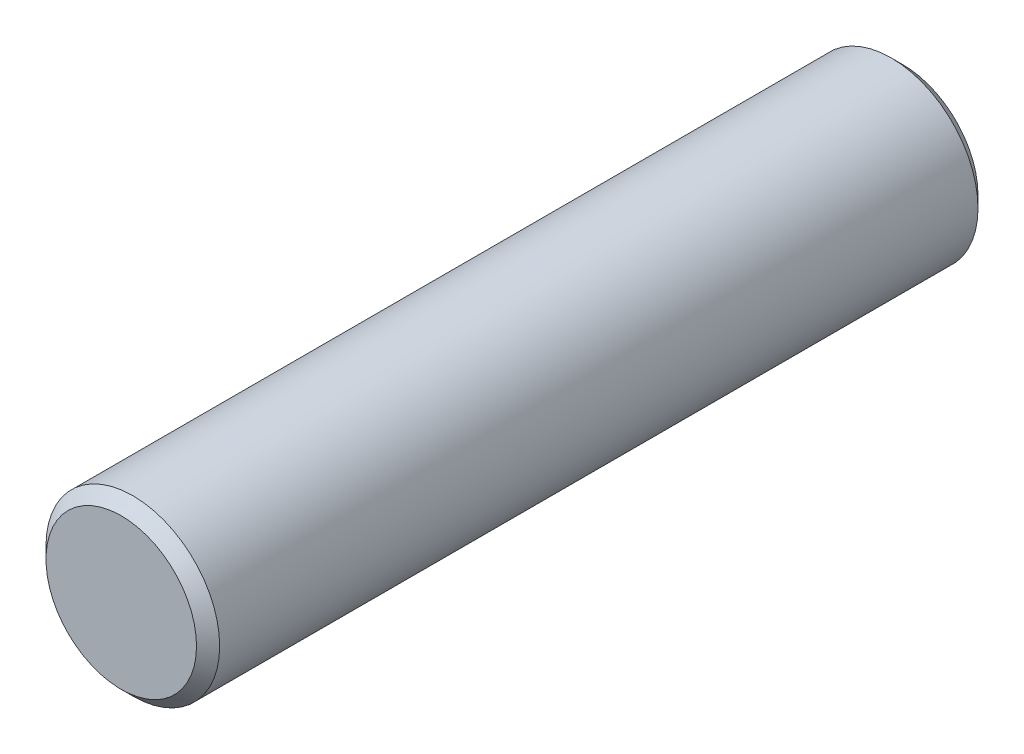
ISO-10303-21;
HEADER;
FILE_DESCRIPTION(('STEP AP214'),'2;1');
FILE_NAME('part.step','',(''),(''),'','','');
FILE_SCHEMA(('AUTOMOTIVE_DESIGN { 1 0 10303 214 1 1 1 1 }'));
ENDSEC;
DATA;
#1=APPLICATION_CONTEXT('core data for automotive mechanical design processes');
#2=APPLICATION_PROTOCOL_DEFINITION('international standard','automotive_design',2000,#1);
#3=PRODUCT_CONTEXT('',#1,'mechanical');
#4=PRODUCT('Part','Part','',(#3));
#5=PRODUCT_RELATED_PRODUCT_CATEGORY('part','',(#4));
#6=PRODUCT_DEFINITION_FORMATION('','',#4);
#7=PRODUCT_DEFINITION_CONTEXT('part definition',#1,'design');
#8=PRODUCT_DEFINITION('design','',#6,#7);
#9=PRODUCT_DEFINITION_SHAPE('','',#8);
#10=(LENGTH_UNIT() NAMED_UNIT(*) SI_UNIT(.MILLI.,.METRE.));
#11=(NAMED_UNIT(*) PLANE_ANGLE_UNIT() SI_UNIT($,.RADIAN.));
#12=(NAMED_UNIT(*) SI_UNIT($,.STERADIAN.) SOLID_ANGLE_UNIT());
#13=UNCERTAINTY_MEASURE_WITH_UNIT(LENGTH_MEASURE(1.E-05),#10,'distance_accuracy_value','');
#14=(GEOMETRIC_REPRESENTATION_CONTEXT(3) GLOBAL_UNCERTAINTY_ASSIGNED_CONTEXT((#13)) GLOBAL_UNIT_ASSIGNED_CONTEXT((#10,
#11,#12)) REPRESENTATION_CONTEXT('',''));
#15=CARTESIAN_POINT('',(0.,0.,0.));
#16=DIRECTION('',(0.,0.,1.));
#17=DIRECTION('',(1.,0.,0.));
#18=AXIS2_PLACEMENT_3D('',#15,#16,#17);
#19=CARTESIAN_POINT('',(0.,0.,6.75));
#20=DIRECTION('',(0.,0.,-1.));
#21=DIRECTION('',(-1.,0.,0.));
#22=AXIS2_PLACEMENT_3D('',#19,#20,#21);
#23=CYLINDRICAL_SURFACE('',#22,1.5);
#24=CARTESIAN_POINT('',(0.,0.,-6.55));
#25=DIRECTION('',(0.,0.,1.));
#26=DIRECTION('',(1.,0.,0.));
#27=AXIS2_PLACEMENT_3D('',#24,#25,#26);
#28=CIRCLE('',#27,1.5);
#29=CARTESIAN_POINT('',(1.5,0.,-6.55));
#30=VERTEX_POINT('',#29);
#31=EDGE_CURVE('E44',#30,#30,#28,.T.);
#32=ORIENTED_EDGE('',*,*,#31,.T.);
#33=EDGE_LOOP('',(#32));
#34=FACE_BOUND('',#33,.T.);
#35=CARTESIAN_POINT('',(0.,0.,6.55));
#36=DIRECTION('',(0.,0.,1.));
#37=DIRECTION('',(1.,0.,0.));
#38=AXIS2_PLACEMENT_3D('',#35,#36,#37);
#39=CIRCLE('',#38,1.5);
#40=CARTESIAN_POINT('',(1.5,0.,6.55));
#41=VERTEX_POINT('',#40);
#42=EDGE_CURVE('E48',#41,#41,#39,.F.);
#43=ORIENTED_EDGE('',*,*,#42,.T.);
#44=EDGE_LOOP('',(#43));
#45=FACE_BOUND('',#44,.T.);
#46=ADVANCED_FACE('F33',(#34,#45),#23,.T.);
#47=CARTESIAN_POINT('',(0.,0.,6.75));
#48=DIRECTION('',(0.,0.,1.));
#49=DIRECTION('',(1.,0.,0.));
#50=AXIS2_PLACEMENT_3D('',#47,#48,#49);
#51=PLANE('',#50);
#52=CARTESIAN_POINT('',(0.,0.,6.75));
#53=DIRECTION('',(0.,0.,1.));
#54=DIRECTION('',(1.,0.,0.));
#55=AXIS2_PLACEMENT_3D('',#52,#53,#54);
#56=CIRCLE('',#55,1.30000000000001);
#57=CARTESIAN_POINT('',(1.30000000000001,0.,6.75));
#58=VERTEX_POINT('',#57);
#59=EDGE_CURVE('E10',#58,#58,#56,.T.);
#60=ORIENTED_EDGE('',*,*,#59,.T.);
#61=EDGE_LOOP('',(#60));
#62=FACE_BOUND('',#61,.T.);
#63=ADVANCED_FACE('F64',(#62),#51,.T.);
#64=CARTESIAN_POINT('',(0.,0.,-6.75));
#65=DIRECTION('',(0.,0.,1.));
#66=DIRECTION('',(1.,0.,0.));
#67=AXIS2_PLACEMENT_3D('',#64,#65,#66);
#68=PLANE('',#67);
#69=CARTESIAN_POINT('',(0.,0.,-6.75));
#70=DIRECTION('',(0.,0.,1.));
#71=DIRECTION('',(1.,0.,0.));
#72=AXIS2_PLACEMENT_3D('',#69,#70,#71);
#73=CIRCLE('',#72,1.3);
#74=CARTESIAN_POINT('',(1.3,0.,-6.75));
#75=VERTEX_POINT('',#74);
#76=EDGE_CURVE('E40',#75,#75,#73,.F.);
#77=ORIENTED_EDGE('',*,*,#76,.T.);
#78=EDGE_LOOP('',(#77));
#79=FACE_BOUND('',#78,.T.);
#80=ADVANCED_FACE('F61',(#79),#68,.F.);
#81=CARTESIAN_POINT('',(0.,0.,-6.55));
#82=DIRECTION('',(0.,0.,1.));
#83=DIRECTION('',(1.,0.,0.));
#84=AXIS2_PLACEMENT_3D('',#81,#82,#83);
#85=CONICAL_SURFACE('',#84,1.5,0.78539816339745);
#86=ORIENTED_EDGE('',*,*,#76,.F.);
#87=EDGE_LOOP('',(#86));
#88=FACE_BOUND('',#87,.T.);
#89=ORIENTED_EDGE('',*,*,#31,.F.);
#90=EDGE_LOOP('',(#89));
#91=FACE_BOUND('',#90,.T.);
#92=ADVANCED_FACE('F57',(#88,#91),#85,.T.);
#93=CARTESIAN_POINT('',(0.,0.,6.75));
#94=DIRECTION('',(0.,0.,-1.));
#95=DIRECTION('',(-1.,0.,0.));
#96=AXIS2_PLACEMENT_3D('',#93,#94,#95);
#97=CONICAL_SURFACE('',#96,1.30000000000001,0.785398163397446);
#98=ORIENTED_EDGE('',*,*,#42,.F.);
#99=EDGE_LOOP('',(#98));
#100=FACE_BOUND('',#99,.T.);
#101=ORIENTED_EDGE('',*,*,#59,.F.);
#102=EDGE_LOOP('',(#101));
#103=FACE_BOUND('',#102,.T.);
#104=ADVANCED_FACE('F35',(#100,#103),#97,.T.);
#105=CLOSED_SHELL('',(#46,#63,#80,#92,#104));
#106=MANIFOLD_SOLID_BREP('B2',#105);
#107=ADVANCED_BREP_SHAPE_REPRESENTATION('',(#18,#106),#14);
#108=SHAPE_DEFINITION_REPRESENTATION(#9,#107);
ENDSEC;
END-ISO-10303-21;
